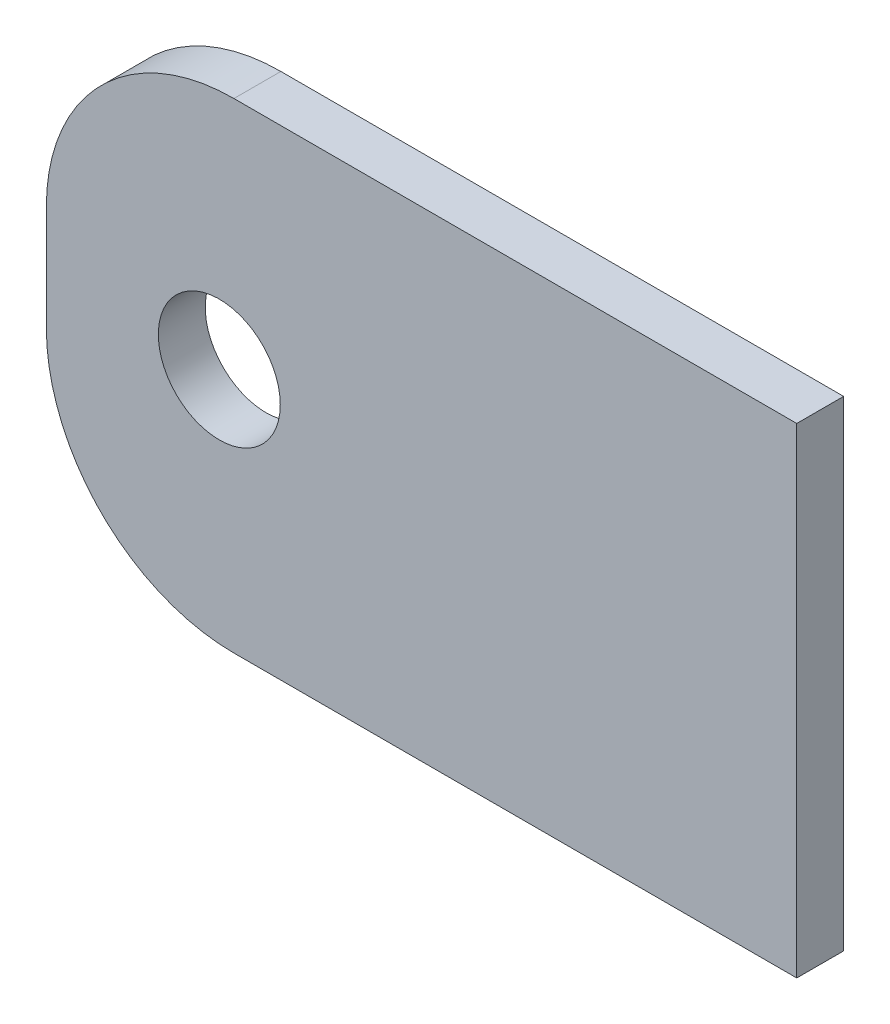
ISO-10303-21;
HEADER;
FILE_DESCRIPTION(('STEP AP214'),'2;1');
FILE_NAME('part.step','',(''),(''),'','','');
FILE_SCHEMA(('AUTOMOTIVE_DESIGN { 1 0 10303 214 1 1 1 1 }'));
ENDSEC;
DATA;
#1=APPLICATION_CONTEXT('core data for automotive mechanical design processes');
#2=APPLICATION_PROTOCOL_DEFINITION('international standard','automotive_design',2000,#1);
#3=PRODUCT_CONTEXT('',#1,'mechanical');
#4=PRODUCT('Part','Part','',(#3));
#5=PRODUCT_RELATED_PRODUCT_CATEGORY('part','',(#4));
#6=PRODUCT_DEFINITION_FORMATION('','',#4);
#7=PRODUCT_DEFINITION_CONTEXT('part definition',#1,'design');
#8=PRODUCT_DEFINITION('design','',#6,#7);
#9=PRODUCT_DEFINITION_SHAPE('','',#8);
#10=(LENGTH_UNIT() NAMED_UNIT(*) SI_UNIT(.MILLI.,.METRE.));
#11=(NAMED_UNIT(*) PLANE_ANGLE_UNIT() SI_UNIT($,.RADIAN.));
#12=(NAMED_UNIT(*) SI_UNIT($,.STERADIAN.) SOLID_ANGLE_UNIT());
#13=UNCERTAINTY_MEASURE_WITH_UNIT(LENGTH_MEASURE(1.E-05),#10,'distance_accuracy_value','');
#14=(GEOMETRIC_REPRESENTATION_CONTEXT(3) GLOBAL_UNCERTAINTY_ASSIGNED_CONTEXT((#13)) GLOBAL_UNIT_ASSIGNED_CONTEXT((#10,
#11,#12)) REPRESENTATION_CONTEXT('',''));
#15=CARTESIAN_POINT('',(0.,0.,0.));
#16=DIRECTION('',(0.,0.,1.));
#17=DIRECTION('',(1.,0.,0.));
#18=AXIS2_PLACEMENT_3D('',#15,#16,#17);
#19=CARTESIAN_POINT('',(-11.2187568555759,-12.5078976234004,2.5));
#20=DIRECTION('',(0.,0.,1.));
#21=DIRECTION('',(1.,0.,0.));
#22=AXIS2_PLACEMENT_3D('',#19,#20,#21);
#23=PLANE('',#22);
#24=CARTESIAN_POINT('',(-11.2187568555759,-12.5078976234004,2.5));
#25=DIRECTION('',(0.,0.,1.));
#26=DIRECTION('',(1.,0.,0.));
#27=AXIS2_PLACEMENT_3D('',#24,#25,#26);
#28=CIRCLE('',#27,10.);
#29=CARTESIAN_POINT('',(-21.2187568555759,-12.5078976234004,2.5));
#30=VERTEX_POINT('',#29);
#31=CARTESIAN_POINT('',(-11.2187568555759,-22.5078976234004,2.5));
#32=VERTEX_POINT('',#31);
#33=EDGE_CURVE('E146',#30,#32,#28,.T.);
#34=ORIENTED_EDGE('',*,*,#33,.T.);
#35=DIRECTION('',(1.,0.,0.));
#36=VECTOR('',#35,1.);
#37=CARTESIAN_POINT('',(-11.2187568555759,-22.5078976234004,2.5));
#38=LINE('',#37,#36);
#39=CARTESIAN_POINT('',(18.7812431444241,-22.5078976234004,2.5));
#40=VERTEX_POINT('',#39);
#41=EDGE_CURVE('E94',#32,#40,#38,.T.);
#42=ORIENTED_EDGE('',*,*,#41,.T.);
#43=DIRECTION('',(0.,1.,0.));
#44=VECTOR('',#43,1.);
#45=CARTESIAN_POINT('',(18.7812431444241,3.09210237659964,2.5));
#46=LINE('',#45,#44);
#47=CARTESIAN_POINT('',(18.7812431444241,3.09210237659964,2.5));
#48=VERTEX_POINT('',#47);
#49=EDGE_CURVE('E107',#40,#48,#46,.T.);
#50=ORIENTED_EDGE('',*,*,#49,.T.);
#51=DIRECTION('',(-1.,0.,0.));
#52=VECTOR('',#51,1.);
#53=CARTESIAN_POINT('',(-11.2187568555759,3.09210237659964,2.5));
#54=LINE('',#53,#52);
#55=CARTESIAN_POINT('',(-11.2187568555759,3.09210237659964,2.5));
#56=VERTEX_POINT('',#55);
#57=EDGE_CURVE('E101',#48,#56,#54,.T.);
#58=ORIENTED_EDGE('',*,*,#57,.T.);
#59=CARTESIAN_POINT('',(-11.2187568555759,-6.90789762340036,2.5));
#60=DIRECTION('',(0.,0.,1.));
#61=DIRECTION('',(-1.,0.,0.));
#62=AXIS2_PLACEMENT_3D('',#59,#60,#61);
#63=CIRCLE('',#62,10.);
#64=CARTESIAN_POINT('',(-21.2187568555759,-6.90789762340036,2.5));
#65=VERTEX_POINT('',#64);
#66=EDGE_CURVE('E105',#56,#65,#63,.T.);
#67=ORIENTED_EDGE('',*,*,#66,.T.);
#68=DIRECTION('',(0.,-1.,0.));
#69=VECTOR('',#68,1.);
#70=CARTESIAN_POINT('',(-21.2187568555759,-6.90789762340036,2.5));
#71=LINE('',#70,#69);
#72=EDGE_CURVE('E57',#65,#30,#71,.T.);
#73=ORIENTED_EDGE('',*,*,#72,.T.);
#74=EDGE_LOOP('',(#34,#42,#50,#58,#67,#73));
#75=FACE_BOUND('',#74,.T.);
#76=CARTESIAN_POINT('',(-12.,-9.80789762340036,2.5));
#77=DIRECTION('',(0.,0.,1.));
#78=DIRECTION('',(1.,0.,0.));
#79=AXIS2_PLACEMENT_3D('',#76,#77,#78);
#80=CIRCLE('',#79,3.25);
#81=CARTESIAN_POINT('',(-8.75,-9.80789762340036,2.5));
#82=VERTEX_POINT('',#81);
#83=EDGE_CURVE('E134',#82,#82,#80,.T.);
#84=ORIENTED_EDGE('',*,*,#83,.F.);
#85=EDGE_LOOP('',(#84));
#86=FACE_BOUND('',#85,.T.);
#87=ADVANCED_FACE('F39',(#75,#86),#23,.T.);
#88=CARTESIAN_POINT('',(-11.2187568555759,-12.5078976234004,0.));
#89=DIRECTION('',(0.,0.,1.));
#90=DIRECTION('',(1.,0.,0.));
#91=AXIS2_PLACEMENT_3D('',#88,#89,#90);
#92=PLANE('',#91);
#93=CARTESIAN_POINT('',(-11.2187568555759,-12.5078976234004,0.));
#94=DIRECTION('',(0.,0.,1.));
#95=DIRECTION('',(1.,0.,0.));
#96=AXIS2_PLACEMENT_3D('',#93,#94,#95);
#97=CIRCLE('',#96,10.);
#98=CARTESIAN_POINT('',(-21.2187568555759,-12.5078976234004,0.));
#99=VERTEX_POINT('',#98);
#100=CARTESIAN_POINT('',(-11.2187568555759,-22.5078976234004,0.));
#101=VERTEX_POINT('',#100);
#102=EDGE_CURVE('E129',#99,#101,#97,.T.);
#103=ORIENTED_EDGE('',*,*,#102,.F.);
#104=DIRECTION('',(0.,-1.,0.));
#105=VECTOR('',#104,1.);
#106=CARTESIAN_POINT('',(-21.2187568555759,-6.90789762340036,0.));
#107=LINE('',#106,#105);
#108=CARTESIAN_POINT('',(-21.2187568555759,-6.90789762340036,0.));
#109=VERTEX_POINT('',#108);
#110=EDGE_CURVE('E86',#109,#99,#107,.T.);
#111=ORIENTED_EDGE('',*,*,#110,.F.);
#112=CARTESIAN_POINT('',(-11.2187568555759,-6.90789762340036,0.));
#113=DIRECTION('',(0.,0.,1.));
#114=DIRECTION('',(-1.,0.,0.));
#115=AXIS2_PLACEMENT_3D('',#112,#113,#114);
#116=CIRCLE('',#115,10.);
#117=CARTESIAN_POINT('',(-11.2187568555759,3.09210237659964,0.));
#118=VERTEX_POINT('',#117);
#119=EDGE_CURVE('E80',#118,#109,#116,.T.);
#120=ORIENTED_EDGE('',*,*,#119,.F.);
#121=DIRECTION('',(-1.,0.,0.));
#122=VECTOR('',#121,1.);
#123=CARTESIAN_POINT('',(-11.2187568555759,3.09210237659964,0.));
#124=LINE('',#123,#122);
#125=CARTESIAN_POINT('',(18.7812431444241,3.09210237659964,0.));
#126=VERTEX_POINT('',#125);
#127=EDGE_CURVE('E116',#126,#118,#124,.T.);
#128=ORIENTED_EDGE('',*,*,#127,.F.);
#129=DIRECTION('',(0.,1.,0.));
#130=VECTOR('',#129,1.);
#131=CARTESIAN_POINT('',(18.7812431444241,3.09210237659964,0.));
#132=LINE('',#131,#130);
#133=CARTESIAN_POINT('',(18.7812431444241,-22.5078976234004,0.));
#134=VERTEX_POINT('',#133);
#135=EDGE_CURVE('E137',#134,#126,#132,.T.);
#136=ORIENTED_EDGE('',*,*,#135,.F.);
#137=DIRECTION('',(1.,0.,0.));
#138=VECTOR('',#137,1.);
#139=CARTESIAN_POINT('',(-11.2187568555759,-22.5078976234004,0.));
#140=LINE('',#139,#138);
#141=EDGE_CURVE('E133',#101,#134,#140,.T.);
#142=ORIENTED_EDGE('',*,*,#141,.F.);
#143=EDGE_LOOP('',(#103,#111,#120,#128,#136,#142));
#144=FACE_BOUND('',#143,.T.);
#145=CARTESIAN_POINT('',(-12.,-9.80789762340036,0.));
#146=DIRECTION('',(0.,0.,1.));
#147=DIRECTION('',(1.,0.,0.));
#148=AXIS2_PLACEMENT_3D('',#145,#146,#147);
#149=CIRCLE('',#148,3.25);
#150=CARTESIAN_POINT('',(-8.75,-9.80789762340036,0.));
#151=VERTEX_POINT('',#150);
#152=EDGE_CURVE('E243',#151,#151,#149,.T.);
#153=ORIENTED_EDGE('',*,*,#152,.T.);
#154=EDGE_LOOP('',(#153));
#155=FACE_BOUND('',#154,.T.);
#156=ADVANCED_FACE('F159',(#144,#155),#92,.F.);
#157=CARTESIAN_POINT('',(-11.2187568555759,-12.5078976234004,2.5));
#158=DIRECTION('',(0.,0.,-1.));
#159=DIRECTION('',(-1.,0.,0.));
#160=AXIS2_PLACEMENT_3D('',#157,#158,#159);
#161=CYLINDRICAL_SURFACE('',#160,10.);
#162=ORIENTED_EDGE('',*,*,#102,.T.);
#163=DIRECTION('',(0.,0.,-1.));
#164=VECTOR('',#163,1.);
#165=CARTESIAN_POINT('',(-11.2187568555759,-22.5078976234004,2.5));
#166=LINE('',#165,#164);
#167=EDGE_CURVE('E11',#32,#101,#166,.T.);
#168=ORIENTED_EDGE('',*,*,#167,.F.);
#169=ORIENTED_EDGE('',*,*,#33,.F.);
#170=DIRECTION('',(0.,0.,-1.));
#171=VECTOR('',#170,1.);
#172=CARTESIAN_POINT('',(-21.2187568555759,-12.5078976234004,2.5));
#173=LINE('',#172,#171);
#174=EDGE_CURVE('E125',#30,#99,#173,.T.);
#175=ORIENTED_EDGE('',*,*,#174,.T.);
#176=EDGE_LOOP('',(#162,#168,#169,#175));
#177=FACE_BOUND('',#176,.T.);
#178=ADVANCED_FACE('F41',(#177),#161,.T.);
#179=CARTESIAN_POINT('',(-11.2187568555759,-22.5078976234004,2.5));
#180=DIRECTION('',(0.,1.,0.));
#181=DIRECTION('',(-1.,0.,0.));
#182=AXIS2_PLACEMENT_3D('',#179,#180,#181);
#183=PLANE('',#182);
#184=ORIENTED_EDGE('',*,*,#141,.T.);
#185=DIRECTION('',(0.,0.,-1.));
#186=VECTOR('',#185,1.);
#187=CARTESIAN_POINT('',(18.7812431444241,-22.5078976234004,2.5));
#188=LINE('',#187,#186);
#189=EDGE_CURVE('E49',#40,#134,#188,.T.);
#190=ORIENTED_EDGE('',*,*,#189,.F.);
#191=ORIENTED_EDGE('',*,*,#41,.F.);
#192=ORIENTED_EDGE('',*,*,#167,.T.);
#193=EDGE_LOOP('',(#184,#190,#191,#192));
#194=FACE_BOUND('',#193,.T.);
#195=ADVANCED_FACE('F184',(#194),#183,.F.);
#196=CARTESIAN_POINT('',(18.7812431444241,3.09210237659964,2.5));
#197=DIRECTION('',(-1.,0.,0.));
#198=DIRECTION('',(0.,-1.,0.));
#199=AXIS2_PLACEMENT_3D('',#196,#197,#198);
#200=PLANE('',#199);
#201=ORIENTED_EDGE('',*,*,#135,.T.);
#202=DIRECTION('',(0.,0.,-1.));
#203=VECTOR('',#202,1.);
#204=CARTESIAN_POINT('',(18.7812431444241,3.09210237659964,2.5));
#205=LINE('',#204,#203);
#206=EDGE_CURVE('E118',#48,#126,#205,.T.);
#207=ORIENTED_EDGE('',*,*,#206,.F.);
#208=ORIENTED_EDGE('',*,*,#49,.F.);
#209=ORIENTED_EDGE('',*,*,#189,.T.);
#210=EDGE_LOOP('',(#201,#207,#208,#209));
#211=FACE_BOUND('',#210,.T.);
#212=ADVANCED_FACE('F156',(#211),#200,.F.);
#213=CARTESIAN_POINT('',(-11.2187568555759,3.09210237659964,2.5));
#214=DIRECTION('',(0.,-1.,0.));
#215=DIRECTION('',(1.,0.,0.));
#216=AXIS2_PLACEMENT_3D('',#213,#214,#215);
#217=PLANE('',#216);
#218=ORIENTED_EDGE('',*,*,#127,.T.);
#219=DIRECTION('',(0.,0.,-1.));
#220=VECTOR('',#219,1.);
#221=CARTESIAN_POINT('',(-11.2187568555759,3.09210237659964,2.5));
#222=LINE('',#221,#220);
#223=EDGE_CURVE('E113',#56,#118,#222,.T.);
#224=ORIENTED_EDGE('',*,*,#223,.F.);
#225=ORIENTED_EDGE('',*,*,#57,.F.);
#226=ORIENTED_EDGE('',*,*,#206,.T.);
#227=EDGE_LOOP('',(#218,#224,#225,#226));
#228=FACE_BOUND('',#227,.T.);
#229=ADVANCED_FACE('F114',(#228),#217,.F.);
#230=CARTESIAN_POINT('',(-11.2187568555759,-6.90789762340036,2.5));
#231=DIRECTION('',(0.,0.,-1.));
#232=DIRECTION('',(-1.,0.,0.));
#233=AXIS2_PLACEMENT_3D('',#230,#231,#232);
#234=CYLINDRICAL_SURFACE('',#233,10.);
#235=ORIENTED_EDGE('',*,*,#119,.T.);
#236=DIRECTION('',(0.,0.,-1.));
#237=VECTOR('',#236,1.);
#238=CARTESIAN_POINT('',(-21.2187568555759,-6.90789762340036,2.5));
#239=LINE('',#238,#237);
#240=EDGE_CURVE('E119',#65,#109,#239,.T.);
#241=ORIENTED_EDGE('',*,*,#240,.F.);
#242=ORIENTED_EDGE('',*,*,#66,.F.);
#243=ORIENTED_EDGE('',*,*,#223,.T.);
#244=EDGE_LOOP('',(#235,#241,#242,#243));
#245=FACE_BOUND('',#244,.T.);
#246=ADVANCED_FACE('F121',(#245),#234,.T.);
#247=CARTESIAN_POINT('',(-21.2187568555759,-6.90789762340036,2.5));
#248=DIRECTION('',(1.,0.,0.));
#249=DIRECTION('',(0.,0.,-1.));
#250=AXIS2_PLACEMENT_3D('',#247,#248,#249);
#251=PLANE('',#250);
#252=ORIENTED_EDGE('',*,*,#110,.T.);
#253=ORIENTED_EDGE('',*,*,#174,.F.);
#254=ORIENTED_EDGE('',*,*,#72,.F.);
#255=ORIENTED_EDGE('',*,*,#240,.T.);
#256=EDGE_LOOP('',(#252,#253,#254,#255));
#257=FACE_BOUND('',#256,.T.);
#258=ADVANCED_FACE('F164',(#257),#251,.F.);
#259=CARTESIAN_POINT('',(-12.,-9.80789762340036,2.5));
#260=DIRECTION('',(0.,0.,-1.));
#261=DIRECTION('',(-1.,0.,0.));
#262=AXIS2_PLACEMENT_3D('',#259,#260,#261);
#263=CYLINDRICAL_SURFACE('',#262,3.25);
#264=ORIENTED_EDGE('',*,*,#83,.T.);
#265=EDGE_LOOP('',(#264));
#266=FACE_BOUND('',#265,.T.);
#267=ORIENTED_EDGE('',*,*,#152,.F.);
#268=EDGE_LOOP('',(#267));
#269=FACE_BOUND('',#268,.T.);
#270=ADVANCED_FACE('F166',(#266,#269),#263,.F.);
#271=CLOSED_SHELL('',(#87,#156,#178,#195,#212,#229,#246,#258,#270));
#272=MANIFOLD_SOLID_BREP('B2',#271);
#273=ADVANCED_BREP_SHAPE_REPRESENTATION('',(#18,#272),#14);
#274=SHAPE_DEFINITION_REPRESENTATION(#9,#273);
ENDSEC;
END-ISO-10303-21;
